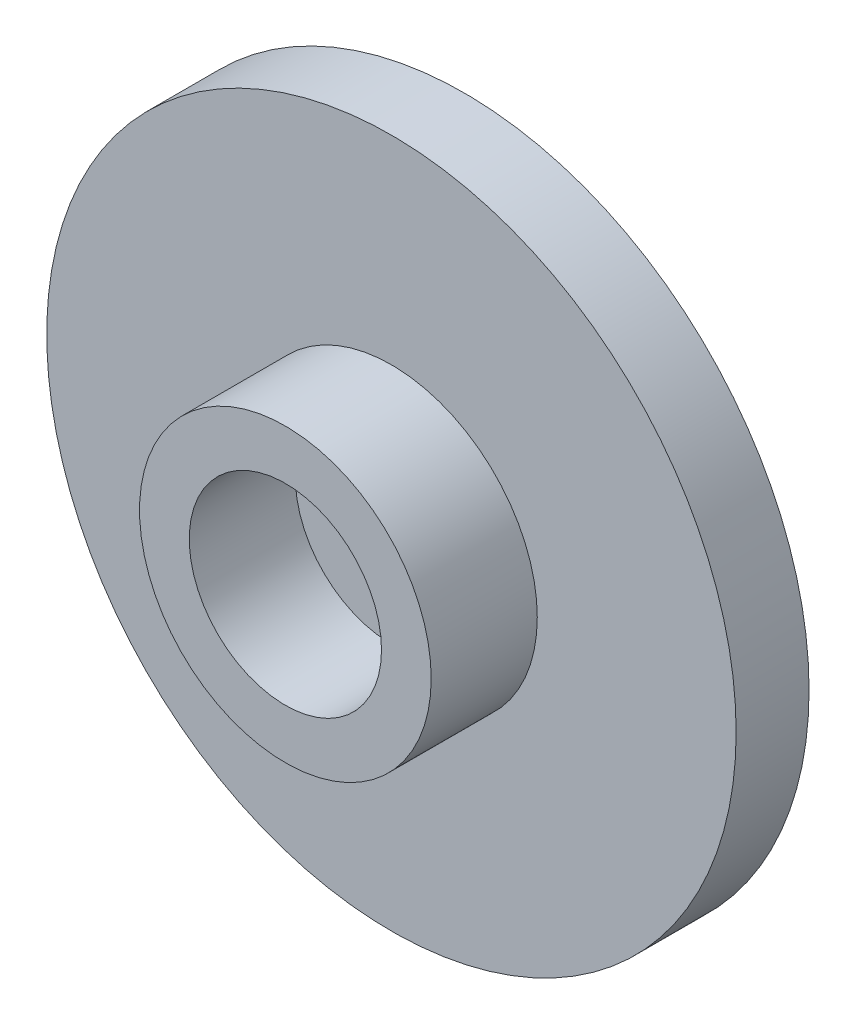
ISO-10303-21;
HEADER;
FILE_DESCRIPTION(('STEP AP214'),'2;1');
FILE_NAME('part.step','',(''),(''),'','','');
FILE_SCHEMA(('AUTOMOTIVE_DESIGN { 1 0 10303 214 1 1 1 1 }'));
ENDSEC;
DATA;
#1=APPLICATION_CONTEXT('core data for automotive mechanical design processes');
#2=APPLICATION_PROTOCOL_DEFINITION('international standard','automotive_design',2000,#1);
#3=PRODUCT_CONTEXT('',#1,'mechanical');
#4=PRODUCT('Part','Part','',(#3));
#5=PRODUCT_RELATED_PRODUCT_CATEGORY('part','',(#4));
#6=PRODUCT_DEFINITION_FORMATION('','',#4);
#7=PRODUCT_DEFINITION_CONTEXT('part definition',#1,'design');
#8=PRODUCT_DEFINITION('design','',#6,#7);
#9=PRODUCT_DEFINITION_SHAPE('','',#8);
#10=(LENGTH_UNIT() NAMED_UNIT(*) SI_UNIT(.MILLI.,.METRE.));
#11=(NAMED_UNIT(*) PLANE_ANGLE_UNIT() SI_UNIT($,.RADIAN.));
#12=(NAMED_UNIT(*) SI_UNIT($,.STERADIAN.) SOLID_ANGLE_UNIT());
#13=UNCERTAINTY_MEASURE_WITH_UNIT(LENGTH_MEASURE(1.E-05),#10,'distance_accuracy_value','');
#14=(GEOMETRIC_REPRESENTATION_CONTEXT(3) GLOBAL_UNCERTAINTY_ASSIGNED_CONTEXT((#13)) GLOBAL_UNIT_ASSIGNED_CONTEXT((#10,
#11,#12)) REPRESENTATION_CONTEXT('',''));
#15=CARTESIAN_POINT('',(0.,0.,0.));
#16=DIRECTION('',(0.,0.,1.));
#17=DIRECTION('',(1.,0.,0.));
#18=AXIS2_PLACEMENT_3D('',#15,#16,#17);
#19=CARTESIAN_POINT('',(0.,0.,2.2));
#20=DIRECTION('',(0.,0.,-1.));
#21=DIRECTION('',(-1.,0.,0.));
#22=AXIS2_PLACEMENT_3D('',#19,#20,#21);
#23=CYLINDRICAL_SURFACE('',#22,10.4);
#24=CARTESIAN_POINT('',(0.,0.,2.2));
#25=DIRECTION('',(0.,0.,1.));
#26=DIRECTION('',(1.,0.,0.));
#27=AXIS2_PLACEMENT_3D('',#24,#25,#26);
#28=CIRCLE('',#27,10.4);
#29=CARTESIAN_POINT('',(10.4,0.,2.2));
#30=VERTEX_POINT('',#29);
#31=EDGE_CURVE('E50',#30,#30,#28,.T.);
#32=ORIENTED_EDGE('',*,*,#31,.F.);
#33=EDGE_LOOP('',(#32));
#34=FACE_BOUND('',#33,.T.);
#35=CARTESIAN_POINT('',(0.,0.,0.));
#36=DIRECTION('',(0.,0.,1.));
#37=DIRECTION('',(1.,0.,0.));
#38=AXIS2_PLACEMENT_3D('',#35,#36,#37);
#39=CIRCLE('',#38,10.4);
#40=CARTESIAN_POINT('',(10.4,0.,0.));
#41=VERTEX_POINT('',#40);
#42=EDGE_CURVE('E55',#41,#41,#39,.T.);
#43=ORIENTED_EDGE('',*,*,#42,.T.);
#44=EDGE_LOOP('',(#43));
#45=FACE_BOUND('',#44,.T.);
#46=ADVANCED_FACE('F43',(#34,#45),#23,.T.);
#47=CARTESIAN_POINT('',(0.,0.,2.2));
#48=DIRECTION('',(0.,0.,1.));
#49=DIRECTION('',(1.,0.,0.));
#50=AXIS2_PLACEMENT_3D('',#47,#48,#49);
#51=PLANE('',#50);
#52=CARTESIAN_POINT('',(0.,0.,2.2));
#53=DIRECTION('',(0.,0.,1.));
#54=DIRECTION('',(1.,0.,0.));
#55=AXIS2_PLACEMENT_3D('',#52,#53,#54);
#56=CIRCLE('',#55,4.4);
#57=CARTESIAN_POINT('',(4.4,0.,2.2));
#58=VERTEX_POINT('',#57);
#59=EDGE_CURVE('E63',#58,#58,#56,.T.);
#60=ORIENTED_EDGE('',*,*,#59,.F.);
#61=EDGE_LOOP('',(#60));
#62=FACE_BOUND('',#61,.T.);
#63=ORIENTED_EDGE('',*,*,#31,.T.);
#64=EDGE_LOOP('',(#63));
#65=FACE_BOUND('',#64,.T.);
#66=ADVANCED_FACE('F90',(#62,#65),#51,.T.);
#67=CARTESIAN_POINT('',(0.,0.,0.));
#68=DIRECTION('',(0.,0.,1.));
#69=DIRECTION('',(1.,0.,0.));
#70=AXIS2_PLACEMENT_3D('',#67,#68,#69);
#71=PLANE('',#70);
#72=ORIENTED_EDGE('',*,*,#42,.F.);
#73=EDGE_LOOP('',(#72));
#74=FACE_BOUND('',#73,.T.);
#75=ADVANCED_FACE('F80',(#74),#71,.F.);
#76=CARTESIAN_POINT('',(0.,0.,5.4));
#77=DIRECTION('',(0.,0.,1.));
#78=DIRECTION('',(1.,0.,0.));
#79=AXIS2_PLACEMENT_3D('',#76,#77,#78);
#80=PLANE('',#79);
#81=CARTESIAN_POINT('',(0.,0.,5.4));
#82=DIRECTION('',(0.,0.,1.));
#83=DIRECTION('',(1.,0.,0.));
#84=AXIS2_PLACEMENT_3D('',#81,#82,#83);
#85=CIRCLE('',#84,4.4);
#86=CARTESIAN_POINT('',(4.4,0.,5.4));
#87=VERTEX_POINT('',#86);
#88=EDGE_CURVE('E61',#87,#87,#85,.T.);
#89=ORIENTED_EDGE('',*,*,#88,.T.);
#90=EDGE_LOOP('',(#89));
#91=FACE_BOUND('',#90,.T.);
#92=CARTESIAN_POINT('',(0.,0.,5.4));
#93=DIRECTION('',(0.,0.,1.));
#94=DIRECTION('',(1.,0.,0.));
#95=AXIS2_PLACEMENT_3D('',#92,#93,#94);
#96=CIRCLE('',#95,2.9);
#97=CARTESIAN_POINT('',(2.9,0.,5.4));
#98=VERTEX_POINT('',#97);
#99=EDGE_CURVE('E67',#98,#98,#96,.T.);
#100=ORIENTED_EDGE('',*,*,#99,.F.);
#101=EDGE_LOOP('',(#100));
#102=FACE_BOUND('',#101,.T.);
#103=ADVANCED_FACE('F77',(#91,#102),#80,.T.);
#104=CARTESIAN_POINT('',(0.,0.,5.4));
#105=DIRECTION('',(0.,0.,-1.));
#106=DIRECTION('',(-1.,0.,0.));
#107=AXIS2_PLACEMENT_3D('',#104,#105,#106);
#108=CYLINDRICAL_SURFACE('',#107,4.4);
#109=ORIENTED_EDGE('',*,*,#88,.F.);
#110=EDGE_LOOP('',(#109));
#111=FACE_BOUND('',#110,.T.);
#112=ORIENTED_EDGE('',*,*,#59,.T.);
#113=EDGE_LOOP('',(#112));
#114=FACE_BOUND('',#113,.T.);
#115=ADVANCED_FACE('F79',(#111,#114),#108,.T.);
#116=CARTESIAN_POINT('',(0.,0.,5.4));
#117=DIRECTION('',(0.,0.,-1.));
#118=DIRECTION('',(-1.,0.,0.));
#119=AXIS2_PLACEMENT_3D('',#116,#117,#118);
#120=CYLINDRICAL_SURFACE('',#119,2.9);
#121=ORIENTED_EDGE('',*,*,#99,.T.);
#122=EDGE_LOOP('',(#121));
#123=FACE_BOUND('',#122,.T.);
#124=CARTESIAN_POINT('',(0.,0.,2.2));
#125=DIRECTION('',(0.,0.,1.));
#126=DIRECTION('',(1.,0.,0.));
#127=AXIS2_PLACEMENT_3D('',#124,#125,#126);
#128=CIRCLE('',#127,2.9);
#129=CARTESIAN_POINT('',(2.9,0.,2.2));
#130=VERTEX_POINT('',#129);
#131=EDGE_CURVE('E10',#130,#130,#128,.F.);
#132=ORIENTED_EDGE('',*,*,#131,.T.);
#133=EDGE_LOOP('',(#132));
#134=FACE_BOUND('',#133,.T.);
#135=ADVANCED_FACE('F75',(#123,#134),#120,.F.);
#136=ORIENTED_EDGE('',*,*,#131,.F.);
#137=EDGE_LOOP('',(#136));
#138=FACE_BOUND('',#137,.T.);
#139=ADVANCED_FACE('F99',(#138),#51,.T.);
#140=CLOSED_SHELL('',(#46,#66,#75,#103,#115,#135,#139));
#141=MANIFOLD_SOLID_BREP('B2',#140);
#142=ADVANCED_BREP_SHAPE_REPRESENTATION('',(#18,#141),#14);
#143=SHAPE_DEFINITION_REPRESENTATION(#9,#142);
ENDSEC;
END-ISO-10303-21;
